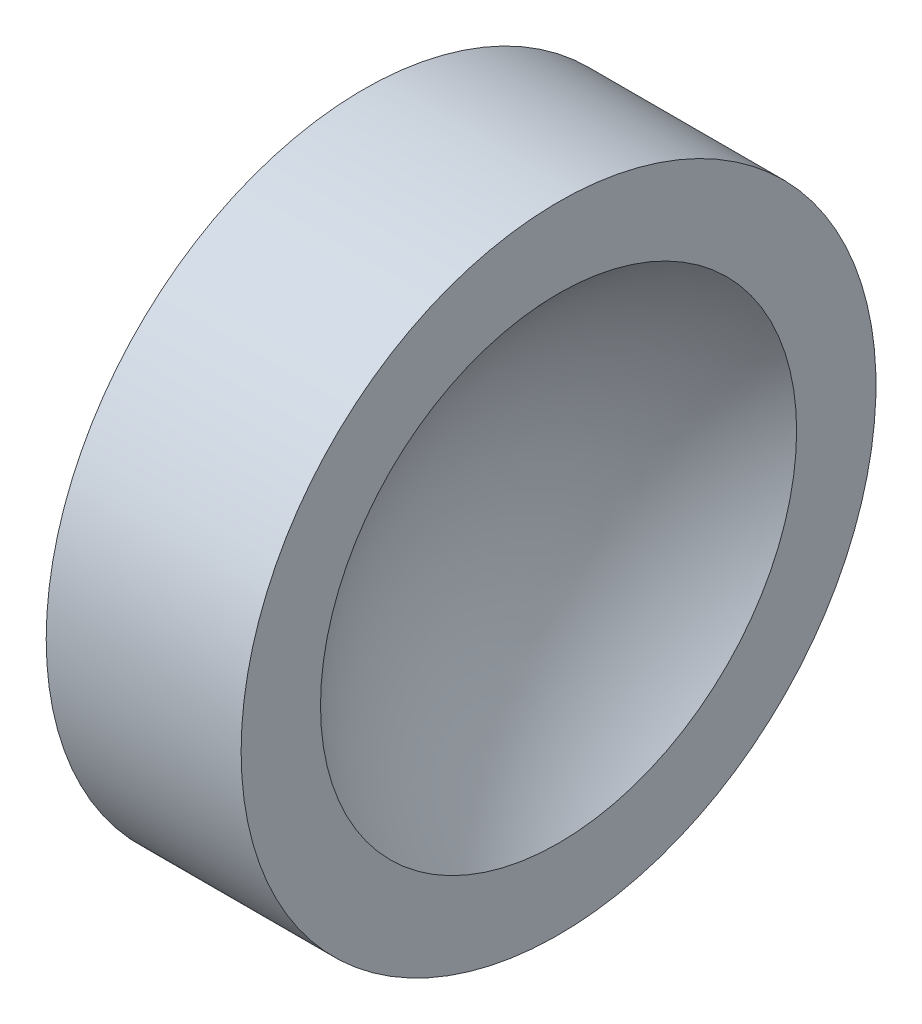
ISO-10303-21;
HEADER;
FILE_DESCRIPTION(('STEP AP214'),'2;1');
FILE_NAME('part.step','',(''),(''),'','','');
FILE_SCHEMA(('AUTOMOTIVE_DESIGN { 1 0 10303 214 1 1 1 1 }'));
ENDSEC;
DATA;
#1=APPLICATION_CONTEXT('core data for automotive mechanical design processes');
#2=APPLICATION_PROTOCOL_DEFINITION('international standard','automotive_design',2000,#1);
#3=PRODUCT_CONTEXT('',#1,'mechanical');
#4=PRODUCT('Part','Part','',(#3));
#5=PRODUCT_RELATED_PRODUCT_CATEGORY('part','',(#4));
#6=PRODUCT_DEFINITION_FORMATION('','',#4);
#7=PRODUCT_DEFINITION_CONTEXT('part definition',#1,'design');
#8=PRODUCT_DEFINITION('design','',#6,#7);
#9=PRODUCT_DEFINITION_SHAPE('','',#8);
#10=(LENGTH_UNIT() NAMED_UNIT(*) SI_UNIT(.MILLI.,.METRE.));
#11=(NAMED_UNIT(*) PLANE_ANGLE_UNIT() SI_UNIT($,.RADIAN.));
#12=(NAMED_UNIT(*) SI_UNIT($,.STERADIAN.) SOLID_ANGLE_UNIT());
#13=UNCERTAINTY_MEASURE_WITH_UNIT(LENGTH_MEASURE(1.E-05),#10,'distance_accuracy_value','');
#14=(GEOMETRIC_REPRESENTATION_CONTEXT(3) GLOBAL_UNCERTAINTY_ASSIGNED_CONTEXT((#13)) GLOBAL_UNIT_ASSIGNED_CONTEXT((#10,
#11,#12)) REPRESENTATION_CONTEXT('',''));
#15=CARTESIAN_POINT('',(0.,0.,0.));
#16=DIRECTION('',(0.,0.,1.));
#17=DIRECTION('',(1.,0.,0.));
#18=AXIS2_PLACEMENT_3D('',#15,#16,#17);
#19=CARTESIAN_POINT('',(0.,0.,0.));
#20=DIRECTION('',(-1.,0.,0.));
#21=DIRECTION('',(0.,0.,1.));
#22=AXIS2_PLACEMENT_3D('',#19,#20,#21);
#23=PLANE('',#22);
#24=CARTESIAN_POINT('',(0.,0.,0.));
#25=DIRECTION('',(-1.,0.,0.));
#26=DIRECTION('',(0.,0.,1.));
#27=AXIS2_PLACEMENT_3D('',#24,#25,#26);
#28=CIRCLE('',#27,2.033859);
#29=CARTESIAN_POINT('',(0.,0.,2.033859));
#30=VERTEX_POINT('',#29);
#31=EDGE_CURVE('E43',#30,#30,#28,.T.);
#32=ORIENTED_EDGE('',*,*,#31,.T.);
#33=EDGE_LOOP('',(#32));
#34=FACE_BOUND('',#33,.T.);
#35=ADVANCED_FACE('F33',(#34),#23,.T.);
#36=CARTESIAN_POINT('',(2.798563,0.,0.));
#37=DIRECTION('',(-1.,0.,0.));
#38=DIRECTION('',(0.,1.,0.));
#39=AXIS2_PLACEMENT_3D('',#36,#37,#38);
#40=SPHERICAL_SURFACE('',#39,2.17437318399291);
#41=CARTESIAN_POINT('',(1.24892039289781,0.,0.));
#42=DIRECTION('',(-1.,0.,0.));
#43=DIRECTION('',(0.,0.,1.));
#44=AXIS2_PLACEMENT_3D('',#41,#42,#43);
#45=CIRCLE('',#44,1.525289);
#46=CARTESIAN_POINT('',(1.24892039289781,0.,1.525289));
#47=VERTEX_POINT('',#46);
#48=EDGE_CURVE('E10',#47,#47,#45,.T.);
#49=ORIENTED_EDGE('',*,*,#48,.F.);
#50=EDGE_LOOP('',(#49));
#51=FACE_BOUND('',#50,.T.);
#52=ADVANCED_FACE('F58',(#51),#40,.F.);
#53=CARTESIAN_POINT('',(1.24892039289781,0.,0.));
#54=DIRECTION('',(1.,0.,0.));
#55=DIRECTION('',(0.,0.,-1.));
#56=AXIS2_PLACEMENT_3D('',#53,#54,#55);
#57=PLANE('',#56);
#58=ORIENTED_EDGE('',*,*,#48,.T.);
#59=EDGE_LOOP('',(#58));
#60=FACE_BOUND('',#59,.T.);
#61=CARTESIAN_POINT('',(1.24892039289781,0.,0.));
#62=DIRECTION('',(-1.,0.,0.));
#63=DIRECTION('',(0.,0.,1.));
#64=AXIS2_PLACEMENT_3D('',#61,#62,#63);
#65=CIRCLE('',#64,2.033859);
#66=CARTESIAN_POINT('',(1.24892039289781,0.,2.033859));
#67=VERTEX_POINT('',#66);
#68=EDGE_CURVE('E39',#67,#67,#65,.T.);
#69=ORIENTED_EDGE('',*,*,#68,.F.);
#70=EDGE_LOOP('',(#69));
#71=FACE_BOUND('',#70,.T.);
#72=ADVANCED_FACE('F53',(#60,#71),#57,.T.);
#73=CARTESIAN_POINT('',(0.,0.,0.));
#74=DIRECTION('',(-1.,0.,0.));
#75=DIRECTION('',(0.,0.,1.));
#76=AXIS2_PLACEMENT_3D('',#73,#74,#75);
#77=CYLINDRICAL_SURFACE('',#76,2.033859);
#78=ORIENTED_EDGE('',*,*,#68,.T.);
#79=EDGE_LOOP('',(#78));
#80=FACE_BOUND('',#79,.T.);
#81=ORIENTED_EDGE('',*,*,#31,.F.);
#82=EDGE_LOOP('',(#81));
#83=FACE_BOUND('',#82,.T.);
#84=ADVANCED_FACE('F51',(#80,#83),#77,.T.);
#85=CLOSED_SHELL('',(#35,#52,#72,#84));
#86=MANIFOLD_SOLID_BREP('B2',#85);
#87=ADVANCED_BREP_SHAPE_REPRESENTATION('',(#18,#86),#14);
#88=SHAPE_DEFINITION_REPRESENTATION(#9,#87);
ENDSEC;
END-ISO-10303-21;
